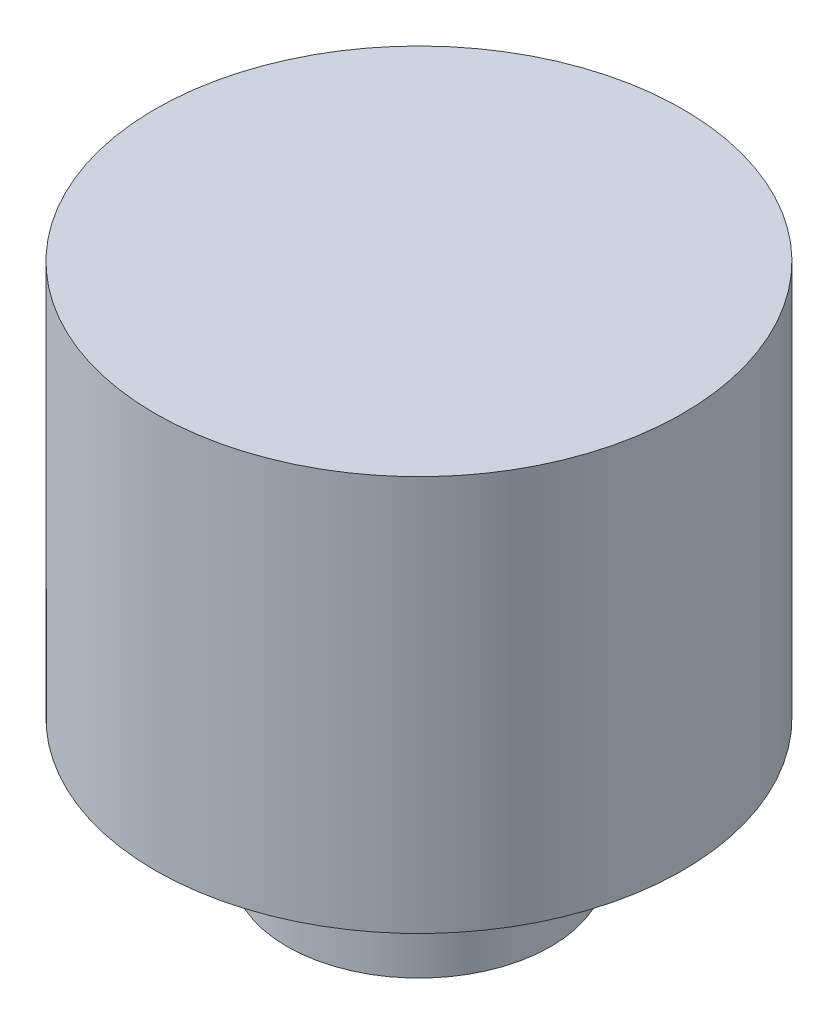
ISO-10303-21;
HEADER;
FILE_DESCRIPTION(('STEP AP214'),'2;1');
FILE_NAME('part.step','',(''),(''),'','','');
FILE_SCHEMA(('AUTOMOTIVE_DESIGN { 1 0 10303 214 1 1 1 1 }'));
ENDSEC;
DATA;
#1=APPLICATION_CONTEXT('core data for automotive mechanical design processes');
#2=APPLICATION_PROTOCOL_DEFINITION('international standard','automotive_design',2000,#1);
#3=PRODUCT_CONTEXT('',#1,'mechanical');
#4=PRODUCT('Part','Part','',(#3));
#5=PRODUCT_RELATED_PRODUCT_CATEGORY('part','',(#4));
#6=PRODUCT_DEFINITION_FORMATION('','',#4);
#7=PRODUCT_DEFINITION_CONTEXT('part definition',#1,'design');
#8=PRODUCT_DEFINITION('design','',#6,#7);
#9=PRODUCT_DEFINITION_SHAPE('','',#8);
#10=(LENGTH_UNIT() NAMED_UNIT(*) SI_UNIT(.MILLI.,.METRE.));
#11=(NAMED_UNIT(*) PLANE_ANGLE_UNIT() SI_UNIT($,.RADIAN.));
#12=(NAMED_UNIT(*) SI_UNIT($,.STERADIAN.) SOLID_ANGLE_UNIT());
#13=UNCERTAINTY_MEASURE_WITH_UNIT(LENGTH_MEASURE(1.E-05),#10,'distance_accuracy_value','');
#14=(GEOMETRIC_REPRESENTATION_CONTEXT(3) GLOBAL_UNCERTAINTY_ASSIGNED_CONTEXT((#13)) GLOBAL_UNIT_ASSIGNED_CONTEXT((#10,
#11,#12)) REPRESENTATION_CONTEXT('',''));
#15=CARTESIAN_POINT('',(0.,0.,0.));
#16=DIRECTION('',(0.,0.,1.));
#17=DIRECTION('',(1.,0.,0.));
#18=AXIS2_PLACEMENT_3D('',#15,#16,#17);
#19=CARTESIAN_POINT('',(0.,1.,0.));
#20=DIRECTION('',(0.,-1.,0.));
#21=DIRECTION('',(0.,0.,-1.));
#22=AXIS2_PLACEMENT_3D('',#19,#20,#21);
#23=CYLINDRICAL_SURFACE('',#22,1.);
#24=CARTESIAN_POINT('',(0.,1.,0.));
#25=DIRECTION('',(0.,1.,0.));
#26=DIRECTION('',(0.,0.,1.));
#27=AXIS2_PLACEMENT_3D('',#24,#25,#26);
#28=CIRCLE('',#27,1.);
#29=CARTESIAN_POINT('',(0.,1.,1.));
#30=VERTEX_POINT('',#29);
#31=EDGE_CURVE('E10',#30,#30,#28,.T.);
#32=ORIENTED_EDGE('',*,*,#31,.F.);
#33=EDGE_LOOP('',(#32));
#34=FACE_BOUND('',#33,.T.);
#35=CARTESIAN_POINT('',(0.,0.,0.));
#36=DIRECTION('',(0.,1.,0.));
#37=DIRECTION('',(0.,0.,1.));
#38=AXIS2_PLACEMENT_3D('',#35,#36,#37);
#39=CIRCLE('',#38,1.);
#40=CARTESIAN_POINT('',(0.,0.,1.));
#41=VERTEX_POINT('',#40);
#42=EDGE_CURVE('E40',#41,#41,#39,.T.);
#43=ORIENTED_EDGE('',*,*,#42,.T.);
#44=EDGE_LOOP('',(#43));
#45=FACE_BOUND('',#44,.T.);
#46=ADVANCED_FACE('F37',(#34,#45),#23,.T.);
#47=CARTESIAN_POINT('',(0.,0.,0.));
#48=DIRECTION('',(0.,1.,0.));
#49=DIRECTION('',(0.,0.,1.));
#50=AXIS2_PLACEMENT_3D('',#47,#48,#49);
#51=PLANE('',#50);
#52=ORIENTED_EDGE('',*,*,#42,.F.);
#53=EDGE_LOOP('',(#52));
#54=FACE_BOUND('',#53,.T.);
#55=ADVANCED_FACE('F64',(#54),#51,.F.);
#56=CARTESIAN_POINT('',(0.,4.,0.));
#57=DIRECTION('',(0.,-1.,0.));
#58=DIRECTION('',(0.,0.,-1.));
#59=AXIS2_PLACEMENT_3D('',#56,#57,#58);
#60=CYLINDRICAL_SURFACE('',#59,2.);
#61=CARTESIAN_POINT('',(0.,4.,0.));
#62=DIRECTION('',(0.,1.,0.));
#63=DIRECTION('',(0.,0.,1.));
#64=AXIS2_PLACEMENT_3D('',#61,#62,#63);
#65=CIRCLE('',#64,2.);
#66=CARTESIAN_POINT('',(0.,4.,2.));
#67=VERTEX_POINT('',#66);
#68=EDGE_CURVE('E49',#67,#67,#65,.T.);
#69=ORIENTED_EDGE('',*,*,#68,.F.);
#70=EDGE_LOOP('',(#69));
#71=FACE_BOUND('',#70,.T.);
#72=CARTESIAN_POINT('',(0.,1.,0.));
#73=DIRECTION('',(0.,1.,0.));
#74=DIRECTION('',(0.,0.,1.));
#75=AXIS2_PLACEMENT_3D('',#72,#73,#74);
#76=CIRCLE('',#75,2.);
#77=CARTESIAN_POINT('',(0.,1.,2.));
#78=VERTEX_POINT('',#77);
#79=EDGE_CURVE('E51',#78,#78,#76,.T.);
#80=ORIENTED_EDGE('',*,*,#79,.T.);
#81=EDGE_LOOP('',(#80));
#82=FACE_BOUND('',#81,.T.);
#83=ADVANCED_FACE('F61',(#71,#82),#60,.T.);
#84=CARTESIAN_POINT('',(0.,4.,0.));
#85=DIRECTION('',(0.,1.,0.));
#86=DIRECTION('',(0.,0.,1.));
#87=AXIS2_PLACEMENT_3D('',#84,#85,#86);
#88=PLANE('',#87);
#89=ORIENTED_EDGE('',*,*,#68,.T.);
#90=EDGE_LOOP('',(#89));
#91=FACE_BOUND('',#90,.T.);
#92=ADVANCED_FACE('F59',(#91),#88,.T.);
#93=CARTESIAN_POINT('',(0.,1.,0.));
#94=DIRECTION('',(0.,1.,0.));
#95=DIRECTION('',(0.,0.,1.));
#96=AXIS2_PLACEMENT_3D('',#93,#94,#95);
#97=PLANE('',#96);
#98=ORIENTED_EDGE('',*,*,#31,.T.);
#99=EDGE_LOOP('',(#98));
#100=FACE_BOUND('',#99,.T.);
#101=ORIENTED_EDGE('',*,*,#79,.F.);
#102=EDGE_LOOP('',(#101));
#103=FACE_BOUND('',#102,.T.);
#104=ADVANCED_FACE('F68',(#100,#103),#97,.F.);
#105=CLOSED_SHELL('',(#46,#55,#83,#92,#104));
#106=MANIFOLD_SOLID_BREP('B2',#105);
#107=ADVANCED_BREP_SHAPE_REPRESENTATION('',(#18,#106),#14);
#108=SHAPE_DEFINITION_REPRESENTATION(#9,#107);
ENDSEC;
END-ISO-10303-21;
